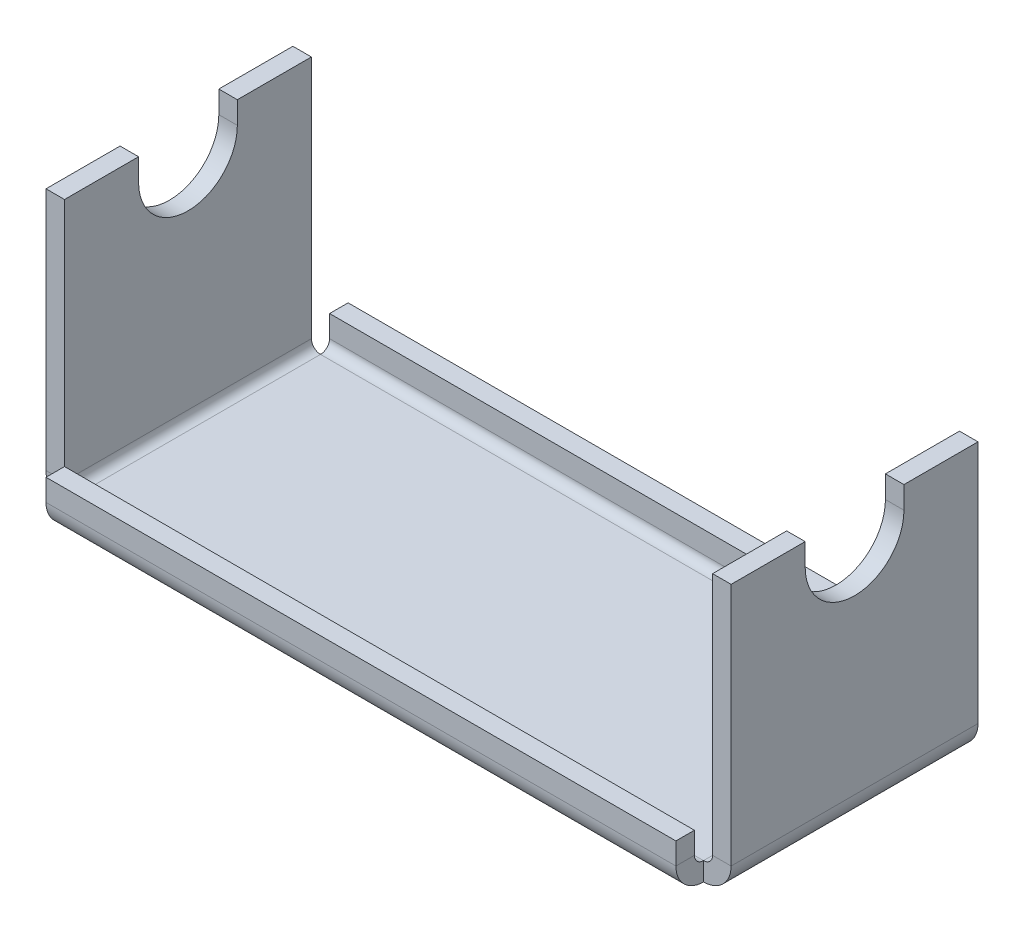
ISO-10303-21;
HEADER;
FILE_DESCRIPTION(('STEP AP214'),'2;1');
FILE_NAME('part.step','',(''),(''),'','','');
FILE_SCHEMA(('AUTOMOTIVE_DESIGN { 1 0 10303 214 1 1 1 1 }'));
ENDSEC;
DATA;
#1=APPLICATION_CONTEXT('core data for automotive mechanical design processes');
#2=APPLICATION_PROTOCOL_DEFINITION('international standard','automotive_design',2000,#1);
#3=PRODUCT_CONTEXT('',#1,'mechanical');
#4=PRODUCT('Part','Part','',(#3));
#5=PRODUCT_RELATED_PRODUCT_CATEGORY('part','',(#4));
#6=PRODUCT_DEFINITION_FORMATION('','',#4);
#7=PRODUCT_DEFINITION_CONTEXT('part definition',#1,'design');
#8=PRODUCT_DEFINITION('design','',#6,#7);
#9=PRODUCT_DEFINITION_SHAPE('','',#8);
#10=(LENGTH_UNIT() NAMED_UNIT(*) SI_UNIT(.MILLI.,.METRE.));
#11=(NAMED_UNIT(*) PLANE_ANGLE_UNIT() SI_UNIT($,.RADIAN.));
#12=(NAMED_UNIT(*) SI_UNIT($,.STERADIAN.) SOLID_ANGLE_UNIT());
#13=UNCERTAINTY_MEASURE_WITH_UNIT(LENGTH_MEASURE(1.E-05),#10,'distance_accuracy_value','');
#14=(GEOMETRIC_REPRESENTATION_CONTEXT(3) GLOBAL_UNCERTAINTY_ASSIGNED_CONTEXT((#13)) GLOBAL_UNIT_ASSIGNED_CONTEXT((#10,
#11,#12)) REPRESENTATION_CONTEXT('',''));
#15=CARTESIAN_POINT('',(0.,0.,0.));
#16=DIRECTION('',(0.,0.,1.));
#17=DIRECTION('',(1.,0.,0.));
#18=AXIS2_PLACEMENT_3D('',#15,#16,#17);
#19=CARTESIAN_POINT('',(-27.7500000000001,20.5,-10.));
#20=DIRECTION('',(0.,-1.,0.));
#21=DIRECTION('',(1.,0.,0.));
#22=AXIS2_PLACEMENT_3D('',#19,#20,#21);
#23=PLANE('',#22);
#24=DIRECTION('',(0.,0.,1.));
#25=VECTOR('',#24,1.);
#26=CARTESIAN_POINT('',(-26.2500000000001,20.5,-10.));
#27=LINE('',#26,#25);
#28=CARTESIAN_POINT('',(-26.2500000000001,20.5,10.));
#29=VERTEX_POINT('',#28);
#30=CARTESIAN_POINT('',(-26.2500000000001,20.5,4.));
#31=VERTEX_POINT('',#30);
#32=EDGE_CURVE('E508',#29,#31,#27,.F.);
#33=ORIENTED_EDGE('',*,*,#32,.T.);
#34=DIRECTION('',(-1.,0.,0.));
#35=VECTOR('',#34,1.);
#36=CARTESIAN_POINT('',(-27.7500000000001,20.5,4.));
#37=LINE('',#36,#35);
#38=CARTESIAN_POINT('',(-27.7500000000001,20.5,4.));
#39=VERTEX_POINT('',#38);
#40=EDGE_CURVE('E343',#31,#39,#37,.T.);
#41=ORIENTED_EDGE('',*,*,#40,.T.);
#42=DIRECTION('',(0.,0.,-1.));
#43=VECTOR('',#42,1.);
#44=CARTESIAN_POINT('',(-27.7500000000001,20.5,0.));
#45=LINE('',#44,#43);
#46=CARTESIAN_POINT('',(-27.7500000000001,20.5,10.));
#47=VERTEX_POINT('',#46);
#48=EDGE_CURVE('E499',#47,#39,#45,.T.);
#49=ORIENTED_EDGE('',*,*,#48,.F.);
#50=DIRECTION('',(1.,0.,0.));
#51=VECTOR('',#50,1.);
#52=CARTESIAN_POINT('',(-27.7500000000001,20.5,10.));
#53=LINE('',#52,#51);
#54=EDGE_CURVE('E489',#47,#29,#53,.T.);
#55=ORIENTED_EDGE('',*,*,#54,.T.);
#56=EDGE_LOOP('',(#33,#41,#49,#55));
#57=FACE_BOUND('',#56,.T.);
#58=ADVANCED_FACE('F120',(#57),#23,.F.);
#59=CARTESIAN_POINT('',(27.7500000000001,20.5,10.));
#60=DIRECTION('',(0.,-1.,0.));
#61=DIRECTION('',(1.,0.,0.));
#62=AXIS2_PLACEMENT_3D('',#59,#60,#61);
#63=PLANE('',#62);
#64=DIRECTION('',(0.,0.,1.));
#65=VECTOR('',#64,1.);
#66=CARTESIAN_POINT('',(27.7500000000001,20.5,0.));
#67=LINE('',#66,#65);
#68=CARTESIAN_POINT('',(27.7500000000001,20.5,4.));
#69=VERTEX_POINT('',#68);
#70=CARTESIAN_POINT('',(27.7500000000001,20.5,10.));
#71=VERTEX_POINT('',#70);
#72=EDGE_CURVE('E443',#69,#71,#67,.T.);
#73=ORIENTED_EDGE('',*,*,#72,.F.);
#74=DIRECTION('',(-1.,0.,0.));
#75=VECTOR('',#74,1.);
#76=CARTESIAN_POINT('',(27.7500000000001,20.5,4.));
#77=LINE('',#76,#75);
#78=CARTESIAN_POINT('',(26.2500000000001,20.5,4.));
#79=VERTEX_POINT('',#78);
#80=EDGE_CURVE('E128',#69,#79,#77,.T.);
#81=ORIENTED_EDGE('',*,*,#80,.T.);
#82=DIRECTION('',(0.,0.,-1.));
#83=VECTOR('',#82,1.);
#84=CARTESIAN_POINT('',(26.2500000000001,20.5,10.));
#85=LINE('',#84,#83);
#86=CARTESIAN_POINT('',(26.2500000000001,20.5,10.));
#87=VERTEX_POINT('',#86);
#88=EDGE_CURVE('E452',#79,#87,#85,.F.);
#89=ORIENTED_EDGE('',*,*,#88,.T.);
#90=DIRECTION('',(-1.,0.,0.));
#91=VECTOR('',#90,1.);
#92=CARTESIAN_POINT('',(27.7500000000001,20.5,10.));
#93=LINE('',#92,#91);
#94=EDGE_CURVE('E439',#71,#87,#93,.T.);
#95=ORIENTED_EDGE('',*,*,#94,.F.);
#96=EDGE_LOOP('',(#73,#81,#89,#95));
#97=FACE_BOUND('',#96,.T.);
#98=ADVANCED_FACE('F561',(#97),#63,.F.);
#99=CARTESIAN_POINT('',(0.,-1.5,0.));
#100=DIRECTION('',(0.,-1.,0.));
#101=DIRECTION('',(0.,0.,-1.));
#102=AXIS2_PLACEMENT_3D('',#99,#100,#101);
#103=PLANE('',#102);
#104=DIRECTION('',(-1.,0.,0.));
#105=VECTOR('',#104,1.);
#106=CARTESIAN_POINT('',(-27.75,-1.5,-10.));
#107=LINE('',#106,#105);
#108=CARTESIAN_POINT('',(25.5134,-1.5,-10.));
#109=VERTEX_POINT('',#108);
#110=CARTESIAN_POINT('',(-25.5134,-1.50000000000001,-10.));
#111=VERTEX_POINT('',#110);
#112=EDGE_CURVE('E545',#109,#111,#107,.T.);
#113=ORIENTED_EDGE('',*,*,#112,.F.);
#114=DIRECTION('',(0.,0.,-1.));
#115=VECTOR('',#114,1.);
#116=CARTESIAN_POINT('',(25.5134,-1.5,-10.));
#117=LINE('',#116,#115);
#118=CARTESIAN_POINT('',(25.5134,-1.5,10.));
#119=VERTEX_POINT('',#118);
#120=EDGE_CURVE('E467',#109,#119,#117,.F.);
#121=ORIENTED_EDGE('',*,*,#120,.T.);
#122=DIRECTION('',(1.,0.,0.));
#123=VECTOR('',#122,1.);
#124=CARTESIAN_POINT('',(-27.75,-1.5,10.));
#125=LINE('',#124,#123);
#126=CARTESIAN_POINT('',(-25.5134,-1.5,10.));
#127=VERTEX_POINT('',#126);
#128=EDGE_CURVE('E548',#127,#119,#125,.T.);
#129=ORIENTED_EDGE('',*,*,#128,.F.);
#130=DIRECTION('',(0.,0.,1.));
#131=VECTOR('',#130,1.);
#132=CARTESIAN_POINT('',(-25.5134,-1.5,10.));
#133=LINE('',#132,#131);
#134=EDGE_CURVE('E523',#127,#111,#133,.F.);
#135=ORIENTED_EDGE('',*,*,#134,.T.);
#136=EDGE_LOOP('',(#113,#121,#129,#135));
#137=FACE_BOUND('',#136,.T.);
#138=ADVANCED_FACE('F599',(#137),#103,.T.);
#139=CARTESIAN_POINT('',(0.,0.,0.));
#140=DIRECTION('',(0.,-1.,0.));
#141=DIRECTION('',(0.,0.,-1.));
#142=AXIS2_PLACEMENT_3D('',#139,#140,#141);
#143=PLANE('',#142);
#144=DIRECTION('',(0.,0.,-1.));
#145=VECTOR('',#144,1.);
#146=CARTESIAN_POINT('',(25.5134,0.,-10.));
#147=LINE('',#146,#145);
#148=CARTESIAN_POINT('',(25.5134,0.,-10.));
#149=VERTEX_POINT('',#148);
#150=CARTESIAN_POINT('',(25.5134,0.,10.));
#151=VERTEX_POINT('',#150);
#152=EDGE_CURVE('E479',#149,#151,#147,.F.);
#153=ORIENTED_EDGE('',*,*,#152,.F.);
#154=DIRECTION('',(-1.,0.,0.));
#155=VECTOR('',#154,1.);
#156=CARTESIAN_POINT('',(-27.75,0.,-10.));
#157=LINE('',#156,#155);
#158=CARTESIAN_POINT('',(-25.5134,0.,-10.));
#159=VERTEX_POINT('',#158);
#160=EDGE_CURVE('E542',#149,#159,#157,.T.);
#161=ORIENTED_EDGE('',*,*,#160,.T.);
#162=DIRECTION('',(0.,0.,1.));
#163=VECTOR('',#162,1.);
#164=CARTESIAN_POINT('',(-25.5134,0.,10.));
#165=LINE('',#164,#163);
#166=CARTESIAN_POINT('',(-25.5134,0.,10.));
#167=VERTEX_POINT('',#166);
#168=EDGE_CURVE('E535',#167,#159,#165,.F.);
#169=ORIENTED_EDGE('',*,*,#168,.F.);
#170=DIRECTION('',(1.,0.,0.));
#171=VECTOR('',#170,1.);
#172=CARTESIAN_POINT('',(-27.75,0.,10.));
#173=LINE('',#172,#171);
#174=EDGE_CURVE('E549',#167,#151,#173,.T.);
#175=ORIENTED_EDGE('',*,*,#174,.T.);
#176=EDGE_LOOP('',(#153,#161,#169,#175));
#177=FACE_BOUND('',#176,.T.);
#178=ADVANCED_FACE('F122',(#177),#143,.F.);
#179=CARTESIAN_POINT('',(-25.5134,0.7366,-10.));
#180=DIRECTION('',(0.,0.,-1.));
#181=DIRECTION('',(-1.,0.,0.));
#182=AXIS2_PLACEMENT_3D('',#179,#180,#181);
#183=PLANE('',#182);
#184=DIRECTION('',(1.,0.,0.));
#185=VECTOR('',#184,1.);
#186=CARTESIAN_POINT('',(-27.75,0.736599999999992,-10.));
#187=LINE('',#186,#185);
#188=CARTESIAN_POINT('',(-26.25,0.736599999999997,-10.));
#189=VERTEX_POINT('',#188);
#190=CARTESIAN_POINT('',(-27.75,0.736599999999992,-10.));
#191=VERTEX_POINT('',#190);
#192=EDGE_CURVE('E486',#189,#191,#187,.F.);
#193=ORIENTED_EDGE('',*,*,#192,.F.);
#194=CARTESIAN_POINT('',(-25.5134,0.7366,-10.));
#195=DIRECTION('',(0.,0.,1.));
#196=DIRECTION('',(1.,0.,0.));
#197=AXIS2_PLACEMENT_3D('',#194,#195,#196);
#198=CIRCLE('',#197,0.7366);
#199=EDGE_CURVE('E532',#159,#189,#198,.F.);
#200=ORIENTED_EDGE('',*,*,#199,.F.);
#201=DIRECTION('',(0.,-1.,0.));
#202=VECTOR('',#201,1.);
#203=CARTESIAN_POINT('',(-25.5134,0.,-10.));
#204=LINE('',#203,#202);
#205=EDGE_CURVE('E539',#159,#111,#204,.T.);
#206=ORIENTED_EDGE('',*,*,#205,.T.);
#207=CARTESIAN_POINT('',(-25.5134,0.7366,-10.));
#208=DIRECTION('',(0.,0.,1.));
#209=DIRECTION('',(1.,0.,0.));
#210=AXIS2_PLACEMENT_3D('',#207,#208,#209);
#211=CIRCLE('',#210,2.2366);
#212=EDGE_CURVE('E525',#111,#191,#211,.F.);
#213=ORIENTED_EDGE('',*,*,#212,.T.);
#214=EDGE_LOOP('',(#193,#200,#206,#213));
#215=FACE_BOUND('',#214,.T.);
#216=ADVANCED_FACE('F639',(#215),#183,.T.);
#217=CARTESIAN_POINT('',(-25.5134,0.7366,10.));
#218=DIRECTION('',(0.,0.,-1.));
#219=DIRECTION('',(-1.,0.,0.));
#220=AXIS2_PLACEMENT_3D('',#217,#218,#219);
#221=PLANE('',#220);
#222=CARTESIAN_POINT('',(-25.5134,0.7366,10.));
#223=DIRECTION('',(0.,0.,1.));
#224=DIRECTION('',(1.,0.,0.));
#225=AXIS2_PLACEMENT_3D('',#222,#223,#224);
#226=CIRCLE('',#225,0.7366);
#227=CARTESIAN_POINT('',(-26.25,0.736599999999997,10.));
#228=VERTEX_POINT('',#227);
#229=EDGE_CURVE('E492',#228,#167,#226,.T.);
#230=ORIENTED_EDGE('',*,*,#229,.F.);
#231=DIRECTION('',(1.,0.,0.));
#232=VECTOR('',#231,1.);
#233=CARTESIAN_POINT('',(-26.25,0.736599999999997,10.));
#234=LINE('',#233,#232);
#235=CARTESIAN_POINT('',(-27.75,0.736599999999992,10.));
#236=VERTEX_POINT('',#235);
#237=EDGE_CURVE('E516',#228,#236,#234,.F.);
#238=ORIENTED_EDGE('',*,*,#237,.T.);
#239=CARTESIAN_POINT('',(-25.5134,0.7366,10.));
#240=DIRECTION('',(0.,0.,1.));
#241=DIRECTION('',(1.,0.,0.));
#242=AXIS2_PLACEMENT_3D('',#239,#240,#241);
#243=CIRCLE('',#242,2.2366);
#244=EDGE_CURVE('E526',#236,#127,#243,.T.);
#245=ORIENTED_EDGE('',*,*,#244,.T.);
#246=DIRECTION('',(0.,-1.,0.));
#247=VECTOR('',#246,1.);
#248=CARTESIAN_POINT('',(-25.5134,0.,10.));
#249=LINE('',#248,#247);
#250=EDGE_CURVE('E529',#167,#127,#249,.T.);
#251=ORIENTED_EDGE('',*,*,#250,.F.);
#252=EDGE_LOOP('',(#230,#238,#245,#251));
#253=FACE_BOUND('',#252,.T.);
#254=ADVANCED_FACE('F656',(#253),#221,.F.);
#255=CARTESIAN_POINT('',(-25.5134,0.7366,10.));
#256=DIRECTION('',(0.,0.,1.));
#257=DIRECTION('',(-1.,0.,0.));
#258=AXIS2_PLACEMENT_3D('',#255,#256,#257);
#259=CYLINDRICAL_SURFACE('',#258,2.2366);
#260=ORIENTED_EDGE('',*,*,#134,.F.);
#261=ORIENTED_EDGE('',*,*,#244,.F.);
#262=DIRECTION('',(0.,0.,1.));
#263=VECTOR('',#262,1.);
#264=CARTESIAN_POINT('',(-27.75,0.736599999999992,-10.));
#265=LINE('',#264,#263);
#266=EDGE_CURVE('E514',#236,#191,#265,.F.);
#267=ORIENTED_EDGE('',*,*,#266,.T.);
#268=ORIENTED_EDGE('',*,*,#212,.F.);
#269=EDGE_LOOP('',(#260,#261,#267,#268));
#270=FACE_BOUND('',#269,.T.);
#271=ADVANCED_FACE('F653',(#270),#259,.T.);
#272=CARTESIAN_POINT('',(-25.5134,0.7366,10.));
#273=DIRECTION('',(0.,0.,1.));
#274=DIRECTION('',(-1.,0.,0.));
#275=AXIS2_PLACEMENT_3D('',#272,#273,#274);
#276=CYLINDRICAL_SURFACE('',#275,0.7366);
#277=ORIENTED_EDGE('',*,*,#168,.T.);
#278=ORIENTED_EDGE('',*,*,#199,.T.);
#279=DIRECTION('',(0.,0.,1.));
#280=VECTOR('',#279,1.);
#281=CARTESIAN_POINT('',(-26.25,0.736599999999997,-10.));
#282=LINE('',#281,#280);
#283=EDGE_CURVE('E519',#189,#228,#282,.T.);
#284=ORIENTED_EDGE('',*,*,#283,.T.);
#285=ORIENTED_EDGE('',*,*,#229,.T.);
#286=EDGE_LOOP('',(#277,#278,#284,#285));
#287=FACE_BOUND('',#286,.T.);
#288=ADVANCED_FACE('F642',(#287),#276,.F.);
#289=CARTESIAN_POINT('',(-27.7500000000001,20.5,10.));
#290=DIRECTION('',(0.,0.,-1.));
#291=DIRECTION('',(-1.,0.,0.));
#292=AXIS2_PLACEMENT_3D('',#289,#290,#291);
#293=PLANE('',#292);
#294=ORIENTED_EDGE('',*,*,#237,.F.);
#295=DIRECTION('',(0.,-1.,0.));
#296=VECTOR('',#295,1.);
#297=CARTESIAN_POINT('',(-26.2500000000001,20.5,10.));
#298=LINE('',#297,#296);
#299=EDGE_CURVE('E512',#228,#29,#298,.F.);
#300=ORIENTED_EDGE('',*,*,#299,.T.);
#301=ORIENTED_EDGE('',*,*,#54,.F.);
#302=DIRECTION('',(0.,1.,0.));
#303=VECTOR('',#302,1.);
#304=CARTESIAN_POINT('',(-27.75,-1.03862598166849E-13,10.));
#305=LINE('',#304,#303);
#306=EDGE_CURVE('E503',#236,#47,#305,.T.);
#307=ORIENTED_EDGE('',*,*,#306,.F.);
#308=EDGE_LOOP('',(#294,#300,#301,#307));
#309=FACE_BOUND('',#308,.T.);
#310=ADVANCED_FACE('F649',(#309),#293,.F.);
#311=CARTESIAN_POINT('',(-27.75,0.,-10.));
#312=DIRECTION('',(0.,0.,1.));
#313=DIRECTION('',(1.,0.,0.));
#314=AXIS2_PLACEMENT_3D('',#311,#312,#313);
#315=PLANE('',#314);
#316=ORIENTED_EDGE('',*,*,#192,.T.);
#317=DIRECTION('',(0.,-1.,0.));
#318=VECTOR('',#317,1.);
#319=CARTESIAN_POINT('',(-27.75,-1.03862598166849E-13,-10.));
#320=LINE('',#319,#318);
#321=CARTESIAN_POINT('',(-27.7500000000001,20.5,-10.));
#322=VERTEX_POINT('',#321);
#323=EDGE_CURVE('E496',#322,#191,#320,.T.);
#324=ORIENTED_EDGE('',*,*,#323,.F.);
#325=DIRECTION('',(1.,0.,0.));
#326=VECTOR('',#325,1.);
#327=CARTESIAN_POINT('',(-27.7500000000001,20.5,-10.));
#328=LINE('',#327,#326);
#329=CARTESIAN_POINT('',(-26.2500000000001,20.5,-10.));
#330=VERTEX_POINT('',#329);
#331=EDGE_CURVE('E493',#322,#330,#328,.T.);
#332=ORIENTED_EDGE('',*,*,#331,.T.);
#333=DIRECTION('',(0.,1.,0.));
#334=VECTOR('',#333,1.);
#335=CARTESIAN_POINT('',(-26.25,0.,-10.));
#336=LINE('',#335,#334);
#337=EDGE_CURVE('E505',#330,#189,#336,.F.);
#338=ORIENTED_EDGE('',*,*,#337,.T.);
#339=EDGE_LOOP('',(#316,#324,#332,#338));
#340=FACE_BOUND('',#339,.T.);
#341=ADVANCED_FACE('F636',(#340),#315,.F.);
#342=CARTESIAN_POINT('',(-27.75,-1.03862598166849E-13,0.));
#343=DIRECTION('',(1.,0.,0.));
#344=DIRECTION('',(0.,1.,0.));
#345=AXIS2_PLACEMENT_3D('',#342,#343,#344);
#346=PLANE('',#345);
#347=ORIENTED_EDGE('',*,*,#48,.T.);
#348=DIRECTION('',(0.,1.,0.));
#349=VECTOR('',#348,1.);
#350=CARTESIAN_POINT('',(-27.7500000000001,22.7000000000003,4.));
#351=LINE('',#350,#349);
#352=CARTESIAN_POINT('',(-27.7500000000001,18.7,4.));
#353=VERTEX_POINT('',#352);
#354=EDGE_CURVE('E332',#353,#39,#351,.T.);
#355=ORIENTED_EDGE('',*,*,#354,.F.);
#356=CARTESIAN_POINT('',(-27.7500000000001,18.7000000000002,0.));
#357=DIRECTION('',(1.,0.,0.));
#358=DIRECTION('',(0.,1.,0.));
#359=AXIS2_PLACEMENT_3D('',#356,#357,#358);
#360=CIRCLE('',#359,4.);
#361=CARTESIAN_POINT('',(-27.7500000000001,18.7,-4.));
#362=VERTEX_POINT('',#361);
#363=EDGE_CURVE('E336',#362,#353,#360,.F.);
#364=ORIENTED_EDGE('',*,*,#363,.F.);
#365=DIRECTION('',(0.,-1.,0.));
#366=VECTOR('',#365,1.);
#367=CARTESIAN_POINT('',(-27.7500000000001,18.7000000000003,-4.));
#368=LINE('',#367,#366);
#369=CARTESIAN_POINT('',(-27.7500000000001,20.5,-4.));
#370=VERTEX_POINT('',#369);
#371=EDGE_CURVE('E334',#370,#362,#368,.T.);
#372=ORIENTED_EDGE('',*,*,#371,.F.);
#373=EDGE_CURVE('E502',#370,#322,#45,.T.);
#374=ORIENTED_EDGE('',*,*,#373,.T.);
#375=ORIENTED_EDGE('',*,*,#323,.T.);
#376=ORIENTED_EDGE('',*,*,#266,.F.);
#377=ORIENTED_EDGE('',*,*,#306,.T.);
#378=EDGE_LOOP('',(#347,#355,#364,#372,#374,#375,#376,#377));
#379=FACE_BOUND('',#378,.T.);
#380=ADVANCED_FACE('F615',(#379),#346,.F.);
#381=CARTESIAN_POINT('',(-26.25,0.,0.));
#382=DIRECTION('',(1.,0.,0.));
#383=DIRECTION('',(0.,1.,0.));
#384=AXIS2_PLACEMENT_3D('',#381,#382,#383);
#385=PLANE('',#384);
#386=DIRECTION('',(0.,-1.,0.));
#387=VECTOR('',#386,1.);
#388=CARTESIAN_POINT('',(-26.25,0.,4.));
#389=LINE('',#388,#387);
#390=CARTESIAN_POINT('',(-26.2500000000001,18.7000000000002,4.));
#391=VERTEX_POINT('',#390);
#392=EDGE_CURVE('E346',#31,#391,#389,.T.);
#393=ORIENTED_EDGE('',*,*,#392,.F.);
#394=ORIENTED_EDGE('',*,*,#32,.F.);
#395=ORIENTED_EDGE('',*,*,#299,.F.);
#396=ORIENTED_EDGE('',*,*,#283,.F.);
#397=ORIENTED_EDGE('',*,*,#337,.F.);
#398=CARTESIAN_POINT('',(-26.2500000000001,20.5,-4.));
#399=VERTEX_POINT('',#398);
#400=EDGE_CURVE('E511',#399,#330,#27,.F.);
#401=ORIENTED_EDGE('',*,*,#400,.F.);
#402=DIRECTION('',(0.,1.,0.));
#403=VECTOR('',#402,1.);
#404=CARTESIAN_POINT('',(-26.25,0.,-4.));
#405=LINE('',#404,#403);
#406=CARTESIAN_POINT('',(-26.2500000000001,18.7000000000002,-4.));
#407=VERTEX_POINT('',#406);
#408=EDGE_CURVE('E135',#407,#399,#405,.T.);
#409=ORIENTED_EDGE('',*,*,#408,.F.);
#410=CARTESIAN_POINT('',(-26.2500000000001,18.7000000000002,0.));
#411=DIRECTION('',(1.,0.,0.));
#412=DIRECTION('',(0.,1.,0.));
#413=AXIS2_PLACEMENT_3D('',#410,#411,#412);
#414=CIRCLE('',#413,4.);
#415=EDGE_CURVE('E348',#391,#407,#414,.T.);
#416=ORIENTED_EDGE('',*,*,#415,.F.);
#417=EDGE_LOOP('',(#393,#394,#395,#396,#397,#401,#409,#416));
#418=FACE_BOUND('',#417,.T.);
#419=ADVANCED_FACE('F606',(#418),#385,.T.);
#420=ORIENTED_EDGE('',*,*,#373,.F.);
#421=DIRECTION('',(1.,0.,0.));
#422=VECTOR('',#421,1.);
#423=CARTESIAN_POINT('',(-27.7500000000001,20.5,-4.));
#424=LINE('',#423,#422);
#425=EDGE_CURVE('E338',#370,#399,#424,.T.);
#426=ORIENTED_EDGE('',*,*,#425,.T.);
#427=ORIENTED_EDGE('',*,*,#400,.T.);
#428=ORIENTED_EDGE('',*,*,#331,.F.);
#429=EDGE_LOOP('',(#420,#426,#427,#428));
#430=FACE_BOUND('',#429,.T.);
#431=ADVANCED_FACE('F595',(#430),#23,.F.);
#432=CARTESIAN_POINT('',(25.5134,0.7366,10.));
#433=DIRECTION('',(0.,0.,1.));
#434=DIRECTION('',(1.,0.,0.));
#435=AXIS2_PLACEMENT_3D('',#432,#433,#434);
#436=PLANE('',#435);
#437=DIRECTION('',(-1.,0.,0.));
#438=VECTOR('',#437,1.);
#439=CARTESIAN_POINT('',(27.75,0.736599999999992,10.));
#440=LINE('',#439,#438);
#441=CARTESIAN_POINT('',(26.25,0.736599999999997,10.));
#442=VERTEX_POINT('',#441);
#443=CARTESIAN_POINT('',(27.75,0.736599999999992,10.));
#444=VERTEX_POINT('',#443);
#445=EDGE_CURVE('E426',#442,#444,#440,.F.);
#446=ORIENTED_EDGE('',*,*,#445,.F.);
#447=CARTESIAN_POINT('',(25.5134,0.7366,10.));
#448=DIRECTION('',(0.,0.,-1.));
#449=DIRECTION('',(-1.,0.,0.));
#450=AXIS2_PLACEMENT_3D('',#447,#448,#449);
#451=CIRCLE('',#450,0.7366);
#452=EDGE_CURVE('E476',#151,#442,#451,.F.);
#453=ORIENTED_EDGE('',*,*,#452,.F.);
#454=DIRECTION('',(0.,-1.,0.));
#455=VECTOR('',#454,1.);
#456=CARTESIAN_POINT('',(25.5134,0.,10.));
#457=LINE('',#456,#455);
#458=EDGE_CURVE('E483',#151,#119,#457,.T.);
#459=ORIENTED_EDGE('',*,*,#458,.T.);
#460=CARTESIAN_POINT('',(25.5134,0.7366,10.));
#461=DIRECTION('',(0.,0.,-1.));
#462=DIRECTION('',(-1.,0.,0.));
#463=AXIS2_PLACEMENT_3D('',#460,#461,#462);
#464=CIRCLE('',#463,2.2366);
#465=EDGE_CURVE('E469',#119,#444,#464,.F.);
#466=ORIENTED_EDGE('',*,*,#465,.T.);
#467=EDGE_LOOP('',(#446,#453,#459,#466));
#468=FACE_BOUND('',#467,.T.);
#469=ADVANCED_FACE('F605',(#468),#436,.T.);
#470=CARTESIAN_POINT('',(25.5134,0.7366,-10.));
#471=DIRECTION('',(0.,0.,1.));
#472=DIRECTION('',(1.,0.,0.));
#473=AXIS2_PLACEMENT_3D('',#470,#471,#472);
#474=PLANE('',#473);
#475=CARTESIAN_POINT('',(25.5134,0.7366,-10.));
#476=DIRECTION('',(0.,0.,-1.));
#477=DIRECTION('',(-1.,0.,0.));
#478=AXIS2_PLACEMENT_3D('',#475,#476,#477);
#479=CIRCLE('',#478,0.7366);
#480=CARTESIAN_POINT('',(26.25,0.736599999999997,-10.));
#481=VERTEX_POINT('',#480);
#482=EDGE_CURVE('E438',#481,#149,#479,.T.);
#483=ORIENTED_EDGE('',*,*,#482,.F.);
#484=DIRECTION('',(-1.,0.,0.));
#485=VECTOR('',#484,1.);
#486=CARTESIAN_POINT('',(26.25,0.736599999999997,-10.));
#487=LINE('',#486,#485);
#488=CARTESIAN_POINT('',(27.75,0.736599999999992,-10.));
#489=VERTEX_POINT('',#488);
#490=EDGE_CURVE('E460',#481,#489,#487,.F.);
#491=ORIENTED_EDGE('',*,*,#490,.T.);
#492=CARTESIAN_POINT('',(25.5134,0.7366,-10.));
#493=DIRECTION('',(0.,0.,-1.));
#494=DIRECTION('',(-1.,0.,0.));
#495=AXIS2_PLACEMENT_3D('',#492,#493,#494);
#496=CIRCLE('',#495,2.2366);
#497=EDGE_CURVE('E470',#489,#109,#496,.T.);
#498=ORIENTED_EDGE('',*,*,#497,.T.);
#499=DIRECTION('',(0.,-1.,0.));
#500=VECTOR('',#499,1.);
#501=CARTESIAN_POINT('',(25.5134,0.,-10.));
#502=LINE('',#501,#500);
#503=EDGE_CURVE('E473',#149,#109,#502,.T.);
#504=ORIENTED_EDGE('',*,*,#503,.F.);
#505=EDGE_LOOP('',(#483,#491,#498,#504));
#506=FACE_BOUND('',#505,.T.);
#507=ADVANCED_FACE('F612',(#506),#474,.F.);
#508=CARTESIAN_POINT('',(25.5134,0.7366,-10.));
#509=DIRECTION('',(0.,0.,-1.));
#510=DIRECTION('',(1.,0.,0.));
#511=AXIS2_PLACEMENT_3D('',#508,#509,#510);
#512=CYLINDRICAL_SURFACE('',#511,2.2366);
#513=ORIENTED_EDGE('',*,*,#120,.F.);
#514=ORIENTED_EDGE('',*,*,#497,.F.);
#515=DIRECTION('',(0.,0.,-1.));
#516=VECTOR('',#515,1.);
#517=CARTESIAN_POINT('',(27.75,0.736599999999992,10.));
#518=LINE('',#517,#516);
#519=EDGE_CURVE('E458',#489,#444,#518,.F.);
#520=ORIENTED_EDGE('',*,*,#519,.T.);
#521=ORIENTED_EDGE('',*,*,#465,.F.);
#522=EDGE_LOOP('',(#513,#514,#520,#521));
#523=FACE_BOUND('',#522,.T.);
#524=ADVANCED_FACE('F727',(#523),#512,.T.);
#525=CARTESIAN_POINT('',(25.5134,0.7366,-10.));
#526=DIRECTION('',(0.,0.,-1.));
#527=DIRECTION('',(1.,0.,0.));
#528=AXIS2_PLACEMENT_3D('',#525,#526,#527);
#529=CYLINDRICAL_SURFACE('',#528,0.7366);
#530=ORIENTED_EDGE('',*,*,#152,.T.);
#531=ORIENTED_EDGE('',*,*,#452,.T.);
#532=DIRECTION('',(0.,0.,-1.));
#533=VECTOR('',#532,1.);
#534=CARTESIAN_POINT('',(26.25,0.736599999999997,10.));
#535=LINE('',#534,#533);
#536=EDGE_CURVE('E463',#442,#481,#535,.T.);
#537=ORIENTED_EDGE('',*,*,#536,.T.);
#538=ORIENTED_EDGE('',*,*,#482,.T.);
#539=EDGE_LOOP('',(#530,#531,#537,#538));
#540=FACE_BOUND('',#539,.T.);
#541=ADVANCED_FACE('F726',(#540),#529,.F.);
#542=CARTESIAN_POINT('',(27.75,0.,10.));
#543=DIRECTION('',(0.,0.,-1.));
#544=DIRECTION('',(-1.,0.,0.));
#545=AXIS2_PLACEMENT_3D('',#542,#543,#544);
#546=PLANE('',#545);
#547=ORIENTED_EDGE('',*,*,#445,.T.);
#548=DIRECTION('',(0.,-1.,0.));
#549=VECTOR('',#548,1.);
#550=CARTESIAN_POINT('',(27.75,-1.03862598166848E-13,10.));
#551=LINE('',#550,#549);
#552=EDGE_CURVE('E446',#71,#444,#551,.T.);
#553=ORIENTED_EDGE('',*,*,#552,.F.);
#554=ORIENTED_EDGE('',*,*,#94,.T.);
#555=DIRECTION('',(0.,1.,0.));
#556=VECTOR('',#555,1.);
#557=CARTESIAN_POINT('',(26.25,0.,10.));
#558=LINE('',#557,#556);
#559=EDGE_CURVE('E455',#87,#442,#558,.F.);
#560=ORIENTED_EDGE('',*,*,#559,.T.);
#561=EDGE_LOOP('',(#547,#553,#554,#560));
#562=FACE_BOUND('',#561,.T.);
#563=ADVANCED_FACE('F571',(#562),#546,.F.);
#564=CARTESIAN_POINT('',(27.7500000000001,20.5,-10.));
#565=DIRECTION('',(0.,0.,1.));
#566=DIRECTION('',(1.,0.,0.));
#567=AXIS2_PLACEMENT_3D('',#564,#565,#566);
#568=PLANE('',#567);
#569=ORIENTED_EDGE('',*,*,#490,.F.);
#570=DIRECTION('',(0.,-1.,0.));
#571=VECTOR('',#570,1.);
#572=CARTESIAN_POINT('',(26.2500000000001,20.5,-10.));
#573=LINE('',#572,#571);
#574=CARTESIAN_POINT('',(26.2500000000001,20.5,-10.));
#575=VERTEX_POINT('',#574);
#576=EDGE_CURVE('E453',#481,#575,#573,.F.);
#577=ORIENTED_EDGE('',*,*,#576,.T.);
#578=DIRECTION('',(-1.,0.,0.));
#579=VECTOR('',#578,1.);
#580=CARTESIAN_POINT('',(27.7500000000001,20.5,-10.));
#581=LINE('',#580,#579);
#582=CARTESIAN_POINT('',(27.7500000000001,20.5,-10.));
#583=VERTEX_POINT('',#582);
#584=EDGE_CURVE('E435',#583,#575,#581,.T.);
#585=ORIENTED_EDGE('',*,*,#584,.F.);
#586=DIRECTION('',(0.,1.,0.));
#587=VECTOR('',#586,1.);
#588=CARTESIAN_POINT('',(27.75,-1.03862598166848E-13,-10.));
#589=LINE('',#588,#587);
#590=EDGE_CURVE('E444',#489,#583,#589,.T.);
#591=ORIENTED_EDGE('',*,*,#590,.F.);
#592=EDGE_LOOP('',(#569,#577,#585,#591));
#593=FACE_BOUND('',#592,.T.);
#594=ADVANCED_FACE('F716',(#593),#568,.F.);
#595=CARTESIAN_POINT('',(27.75,-1.03862598166848E-13,0.));
#596=DIRECTION('',(-1.,0.,0.));
#597=DIRECTION('',(0.,-1.,0.));
#598=AXIS2_PLACEMENT_3D('',#595,#596,#597);
#599=PLANE('',#598);
#600=CARTESIAN_POINT('',(27.75,18.7,0.));
#601=DIRECTION('',(1.,0.,0.));
#602=DIRECTION('',(0.,1.,0.));
#603=AXIS2_PLACEMENT_3D('',#600,#601,#602);
#604=CIRCLE('',#603,4.);
#605=CARTESIAN_POINT('',(27.75,18.7,4.));
#606=VERTEX_POINT('',#605);
#607=CARTESIAN_POINT('',(27.75,18.7,-4.));
#608=VERTEX_POINT('',#607);
#609=EDGE_CURVE('E314',#606,#608,#604,.T.);
#610=ORIENTED_EDGE('',*,*,#609,.F.);
#611=DIRECTION('',(0.,-1.,0.));
#612=VECTOR('',#611,1.);
#613=CARTESIAN_POINT('',(27.7500000000001,22.7,4.));
#614=LINE('',#613,#612);
#615=EDGE_CURVE('E311',#69,#606,#614,.T.);
#616=ORIENTED_EDGE('',*,*,#615,.F.);
#617=ORIENTED_EDGE('',*,*,#72,.T.);
#618=ORIENTED_EDGE('',*,*,#552,.T.);
#619=ORIENTED_EDGE('',*,*,#519,.F.);
#620=ORIENTED_EDGE('',*,*,#590,.T.);
#621=CARTESIAN_POINT('',(27.7500000000001,20.5,-4.));
#622=VERTEX_POINT('',#621);
#623=EDGE_CURVE('E325',#583,#622,#67,.T.);
#624=ORIENTED_EDGE('',*,*,#623,.T.);
#625=DIRECTION('',(0.,1.,0.));
#626=VECTOR('',#625,1.);
#627=CARTESIAN_POINT('',(27.75,18.7,-4.));
#628=LINE('',#627,#626);
#629=EDGE_CURVE('E143',#608,#622,#628,.T.);
#630=ORIENTED_EDGE('',*,*,#629,.F.);
#631=EDGE_LOOP('',(#610,#616,#617,#618,#619,#620,#624,#630));
#632=FACE_BOUND('',#631,.T.);
#633=ADVANCED_FACE('F323',(#632),#599,.F.);
#634=CARTESIAN_POINT('',(26.25,0.,0.));
#635=DIRECTION('',(-1.,0.,0.));
#636=DIRECTION('',(0.,-1.,0.));
#637=AXIS2_PLACEMENT_3D('',#634,#635,#636);
#638=PLANE('',#637);
#639=DIRECTION('',(0.,1.,0.));
#640=VECTOR('',#639,1.);
#641=CARTESIAN_POINT('',(26.25,0.,4.));
#642=LINE('',#641,#640);
#643=CARTESIAN_POINT('',(26.25,18.7,4.));
#644=VERTEX_POINT('',#643);
#645=EDGE_CURVE('E341',#644,#79,#642,.T.);
#646=ORIENTED_EDGE('',*,*,#645,.F.);
#647=CARTESIAN_POINT('',(26.25,18.7,0.));
#648=DIRECTION('',(-1.,0.,0.));
#649=DIRECTION('',(0.,-1.,0.));
#650=AXIS2_PLACEMENT_3D('',#647,#648,#649);
#651=CIRCLE('',#650,4.);
#652=CARTESIAN_POINT('',(26.25,18.7,-4.));
#653=VERTEX_POINT('',#652);
#654=EDGE_CURVE('E13',#653,#644,#651,.T.);
#655=ORIENTED_EDGE('',*,*,#654,.F.);
#656=DIRECTION('',(0.,-1.,0.));
#657=VECTOR('',#656,1.);
#658=CARTESIAN_POINT('',(26.25,0.,-4.));
#659=LINE('',#658,#657);
#660=CARTESIAN_POINT('',(26.2500000000001,20.5,-4.));
#661=VERTEX_POINT('',#660);
#662=EDGE_CURVE('E307',#661,#653,#659,.T.);
#663=ORIENTED_EDGE('',*,*,#662,.F.);
#664=EDGE_CURVE('E449',#575,#661,#85,.F.);
#665=ORIENTED_EDGE('',*,*,#664,.F.);
#666=ORIENTED_EDGE('',*,*,#576,.F.);
#667=ORIENTED_EDGE('',*,*,#536,.F.);
#668=ORIENTED_EDGE('',*,*,#559,.F.);
#669=ORIENTED_EDGE('',*,*,#88,.F.);
#670=EDGE_LOOP('',(#646,#655,#663,#665,#666,#667,#668,#669));
#671=FACE_BOUND('',#670,.T.);
#672=ADVANCED_FACE('F567',(#671),#638,.T.);
#673=ORIENTED_EDGE('',*,*,#664,.T.);
#674=DIRECTION('',(1.,0.,0.));
#675=VECTOR('',#674,1.);
#676=CARTESIAN_POINT('',(27.7500000000001,20.5,-4.));
#677=LINE('',#676,#675);
#678=EDGE_CURVE('E552',#661,#622,#677,.T.);
#679=ORIENTED_EDGE('',*,*,#678,.T.);
#680=ORIENTED_EDGE('',*,*,#623,.F.);
#681=ORIENTED_EDGE('',*,*,#584,.T.);
#682=EDGE_LOOP('',(#673,#679,#680,#681));
#683=FACE_BOUND('',#682,.T.);
#684=ADVANCED_FACE('F601',(#683),#63,.F.);
#685=CARTESIAN_POINT('',(-25.5134,0.736599999999997,10.));
#686=DIRECTION('',(-1.,0.,0.));
#687=DIRECTION('',(0.,0.,1.));
#688=AXIS2_PLACEMENT_3D('',#685,#686,#687);
#689=PLANE('',#688);
#690=DIRECTION('',(0.,0.,-1.));
#691=VECTOR('',#690,1.);
#692=CARTESIAN_POINT('',(-25.5134,0.736599999999997,12.2366));
#693=LINE('',#692,#691);
#694=CARTESIAN_POINT('',(-25.5134,0.736599999999997,10.7366));
#695=VERTEX_POINT('',#694);
#696=CARTESIAN_POINT('',(-25.5134,0.736599999999997,12.2366));
#697=VERTEX_POINT('',#696);
#698=EDGE_CURVE('E384',#695,#697,#693,.F.);
#699=ORIENTED_EDGE('',*,*,#698,.F.);
#700=CARTESIAN_POINT('',(-25.5134,0.736599999999997,10.));
#701=DIRECTION('',(1.,0.,0.));
#702=DIRECTION('',(0.,0.,-1.));
#703=AXIS2_PLACEMENT_3D('',#700,#701,#702);
#704=CIRCLE('',#703,0.736599999999997);
#705=EDGE_CURVE('E430',#167,#695,#704,.F.);
#706=ORIENTED_EDGE('',*,*,#705,.F.);
#707=ORIENTED_EDGE('',*,*,#250,.T.);
#708=CARTESIAN_POINT('',(-25.5134,0.736599999999997,10.));
#709=DIRECTION('',(1.,0.,0.));
#710=DIRECTION('',(0.,0.,-1.));
#711=AXIS2_PLACEMENT_3D('',#708,#709,#710);
#712=CIRCLE('',#711,2.2366);
#713=EDGE_CURVE('E423',#127,#697,#712,.F.);
#714=ORIENTED_EDGE('',*,*,#713,.T.);
#715=EDGE_LOOP('',(#699,#706,#707,#714));
#716=FACE_BOUND('',#715,.T.);
#717=ADVANCED_FACE('F669',(#716),#689,.T.);
#718=CARTESIAN_POINT('',(25.5134,0.736599999999997,10.));
#719=DIRECTION('',(-1.,0.,0.));
#720=DIRECTION('',(0.,0.,1.));
#721=AXIS2_PLACEMENT_3D('',#718,#719,#720);
#722=PLANE('',#721);
#723=CARTESIAN_POINT('',(25.5134,0.736599999999997,10.));
#724=DIRECTION('',(1.,0.,0.));
#725=DIRECTION('',(0.,0.,-1.));
#726=AXIS2_PLACEMENT_3D('',#723,#724,#725);
#727=CIRCLE('',#726,0.736599999999997);
#728=CARTESIAN_POINT('',(25.5134,0.736599999999997,10.7366));
#729=VERTEX_POINT('',#728);
#730=EDGE_CURVE('E396',#729,#151,#727,.T.);
#731=ORIENTED_EDGE('',*,*,#730,.F.);
#732=DIRECTION('',(0.,0.,-1.));
#733=VECTOR('',#732,1.);
#734=CARTESIAN_POINT('',(25.5134,0.736599999999997,10.7366));
#735=LINE('',#734,#733);
#736=CARTESIAN_POINT('',(25.5134,0.736599999999997,12.2366));
#737=VERTEX_POINT('',#736);
#738=EDGE_CURVE('E416',#729,#737,#735,.F.);
#739=ORIENTED_EDGE('',*,*,#738,.T.);
#740=CARTESIAN_POINT('',(25.5134,0.736599999999997,10.));
#741=DIRECTION('',(1.,0.,0.));
#742=DIRECTION('',(0.,0.,-1.));
#743=AXIS2_PLACEMENT_3D('',#740,#741,#742);
#744=CIRCLE('',#743,2.2366);
#745=EDGE_CURVE('E427',#737,#119,#744,.T.);
#746=ORIENTED_EDGE('',*,*,#745,.T.);
#747=ORIENTED_EDGE('',*,*,#458,.F.);
#748=EDGE_LOOP('',(#731,#739,#746,#747));
#749=FACE_BOUND('',#748,.T.);
#750=ADVANCED_FACE('F690',(#749),#722,.F.);
#751=CARTESIAN_POINT('',(25.5134,0.736599999999997,10.));
#752=DIRECTION('',(1.,0.,0.));
#753=DIRECTION('',(0.,0.,1.));
#754=AXIS2_PLACEMENT_3D('',#751,#752,#753);
#755=CYLINDRICAL_SURFACE('',#754,2.2366);
#756=ORIENTED_EDGE('',*,*,#128,.T.);
#757=ORIENTED_EDGE('',*,*,#745,.F.);
#758=DIRECTION('',(1.,0.,0.));
#759=VECTOR('',#758,1.);
#760=CARTESIAN_POINT('',(-25.5134,0.736599999999997,12.2366));
#761=LINE('',#760,#759);
#762=EDGE_CURVE('E414',#737,#697,#761,.F.);
#763=ORIENTED_EDGE('',*,*,#762,.T.);
#764=ORIENTED_EDGE('',*,*,#713,.F.);
#765=EDGE_LOOP('',(#756,#757,#763,#764));
#766=FACE_BOUND('',#765,.T.);
#767=ADVANCED_FACE('F704',(#766),#755,.T.);
#768=CARTESIAN_POINT('',(25.5134,0.736599999999997,10.));
#769=DIRECTION('',(1.,0.,0.));
#770=DIRECTION('',(0.,0.,1.));
#771=AXIS2_PLACEMENT_3D('',#768,#769,#770);
#772=CYLINDRICAL_SURFACE('',#771,0.736599999999997);
#773=ORIENTED_EDGE('',*,*,#174,.F.);
#774=ORIENTED_EDGE('',*,*,#705,.T.);
#775=DIRECTION('',(1.,0.,0.));
#776=VECTOR('',#775,1.);
#777=CARTESIAN_POINT('',(-25.5134,0.736599999999997,10.7366));
#778=LINE('',#777,#776);
#779=EDGE_CURVE('E419',#695,#729,#778,.T.);
#780=ORIENTED_EDGE('',*,*,#779,.T.);
#781=ORIENTED_EDGE('',*,*,#730,.T.);
#782=EDGE_LOOP('',(#773,#774,#780,#781));
#783=FACE_BOUND('',#782,.T.);
#784=ADVANCED_FACE('F665',(#783),#772,.F.);
#785=CARTESIAN_POINT('',(-25.5134,0.,12.2366));
#786=DIRECTION('',(1.,0.,0.));
#787=DIRECTION('',(0.,0.,-1.));
#788=AXIS2_PLACEMENT_3D('',#785,#786,#787);
#789=PLANE('',#788);
#790=ORIENTED_EDGE('',*,*,#698,.T.);
#791=DIRECTION('',(0.,-1.,0.));
#792=VECTOR('',#791,1.);
#793=CARTESIAN_POINT('',(-25.5134,0.,12.2366));
#794=LINE('',#793,#792);
#795=CARTESIAN_POINT('',(-25.5134,2.5,12.2366));
#796=VERTEX_POINT('',#795);
#797=EDGE_CURVE('E404',#796,#697,#794,.T.);
#798=ORIENTED_EDGE('',*,*,#797,.F.);
#799=DIRECTION('',(0.,0.,-1.));
#800=VECTOR('',#799,1.);
#801=CARTESIAN_POINT('',(-25.5134,2.5,12.2366));
#802=LINE('',#801,#800);
#803=CARTESIAN_POINT('',(-25.5134,2.5,10.7366));
#804=VERTEX_POINT('',#803);
#805=EDGE_CURVE('E397',#796,#804,#802,.T.);
#806=ORIENTED_EDGE('',*,*,#805,.T.);
#807=DIRECTION('',(0.,1.,0.));
#808=VECTOR('',#807,1.);
#809=CARTESIAN_POINT('',(-25.5134,0.,10.7366));
#810=LINE('',#809,#808);
#811=EDGE_CURVE('E411',#804,#695,#810,.F.);
#812=ORIENTED_EDGE('',*,*,#811,.T.);
#813=EDGE_LOOP('',(#790,#798,#806,#812));
#814=FACE_BOUND('',#813,.T.);
#815=ADVANCED_FACE('F673',(#814),#789,.F.);
#816=CARTESIAN_POINT('',(25.5134,2.5,12.2366));
#817=DIRECTION('',(-1.,0.,0.));
#818=DIRECTION('',(0.,0.,1.));
#819=AXIS2_PLACEMENT_3D('',#816,#817,#818);
#820=PLANE('',#819);
#821=ORIENTED_EDGE('',*,*,#738,.F.);
#822=DIRECTION('',(0.,-1.,0.));
#823=VECTOR('',#822,1.);
#824=CARTESIAN_POINT('',(25.5134,2.5,10.7366));
#825=LINE('',#824,#823);
#826=CARTESIAN_POINT('',(25.5134,2.5,10.7366));
#827=VERTEX_POINT('',#826);
#828=EDGE_CURVE('E409',#729,#827,#825,.F.);
#829=ORIENTED_EDGE('',*,*,#828,.T.);
#830=DIRECTION('',(0.,0.,-1.));
#831=VECTOR('',#830,1.);
#832=CARTESIAN_POINT('',(25.5134,2.5,12.2366));
#833=LINE('',#832,#831);
#834=CARTESIAN_POINT('',(25.5134,2.5,12.2366));
#835=VERTEX_POINT('',#834);
#836=EDGE_CURVE('E393',#835,#827,#833,.T.);
#837=ORIENTED_EDGE('',*,*,#836,.F.);
#838=DIRECTION('',(0.,1.,0.));
#839=VECTOR('',#838,1.);
#840=CARTESIAN_POINT('',(25.5134,0.,12.2366));
#841=LINE('',#840,#839);
#842=EDGE_CURVE('E402',#737,#835,#841,.T.);
#843=ORIENTED_EDGE('',*,*,#842,.F.);
#844=EDGE_LOOP('',(#821,#829,#837,#843));
#845=FACE_BOUND('',#844,.T.);
#846=ADVANCED_FACE('F692',(#845),#820,.F.);
#847=CARTESIAN_POINT('',(0.,0.,12.2366));
#848=DIRECTION('',(0.,0.,-1.));
#849=DIRECTION('',(-1.,0.,0.));
#850=AXIS2_PLACEMENT_3D('',#847,#848,#849);
#851=PLANE('',#850);
#852=ORIENTED_EDGE('',*,*,#762,.F.);
#853=ORIENTED_EDGE('',*,*,#842,.T.);
#854=DIRECTION('',(-1.,0.,0.));
#855=VECTOR('',#854,1.);
#856=CARTESIAN_POINT('',(0.,2.5,12.2366));
#857=LINE('',#856,#855);
#858=EDGE_CURVE('E400',#835,#796,#857,.T.);
#859=ORIENTED_EDGE('',*,*,#858,.T.);
#860=ORIENTED_EDGE('',*,*,#797,.T.);
#861=EDGE_LOOP('',(#852,#853,#859,#860));
#862=FACE_BOUND('',#861,.T.);
#863=ADVANCED_FACE('F677',(#862),#851,.F.);
#864=CARTESIAN_POINT('',(0.,0.,10.7366));
#865=DIRECTION('',(0.,0.,-1.));
#866=DIRECTION('',(-1.,0.,0.));
#867=AXIS2_PLACEMENT_3D('',#864,#865,#866);
#868=PLANE('',#867);
#869=ORIENTED_EDGE('',*,*,#828,.F.);
#870=ORIENTED_EDGE('',*,*,#779,.F.);
#871=ORIENTED_EDGE('',*,*,#811,.F.);
#872=DIRECTION('',(1.,0.,0.));
#873=VECTOR('',#872,1.);
#874=CARTESIAN_POINT('',(-25.5134,2.5,10.7366));
#875=LINE('',#874,#873);
#876=EDGE_CURVE('E407',#827,#804,#875,.F.);
#877=ORIENTED_EDGE('',*,*,#876,.F.);
#878=EDGE_LOOP('',(#869,#870,#871,#877));
#879=FACE_BOUND('',#878,.T.);
#880=ADVANCED_FACE('F687',(#879),#868,.T.);
#881=CARTESIAN_POINT('',(-25.5134,2.5,12.2366));
#882=DIRECTION('',(0.,-1.,0.));
#883=DIRECTION('',(0.,0.,-1.));
#884=AXIS2_PLACEMENT_3D('',#881,#882,#883);
#885=PLANE('',#884);
#886=ORIENTED_EDGE('',*,*,#876,.T.);
#887=ORIENTED_EDGE('',*,*,#805,.F.);
#888=ORIENTED_EDGE('',*,*,#858,.F.);
#889=ORIENTED_EDGE('',*,*,#836,.T.);
#890=EDGE_LOOP('',(#886,#887,#888,#889));
#891=FACE_BOUND('',#890,.T.);
#892=ADVANCED_FACE('F683',(#891),#885,.F.);
#893=CARTESIAN_POINT('',(25.5134,0.736599999999992,-10.));
#894=DIRECTION('',(1.,0.,0.));
#895=DIRECTION('',(0.,0.,-1.));
#896=AXIS2_PLACEMENT_3D('',#893,#894,#895);
#897=PLANE('',#896);
#898=DIRECTION('',(0.,0.,1.));
#899=VECTOR('',#898,1.);
#900=CARTESIAN_POINT('',(25.5134,0.736600000000007,-12.2366));
#901=LINE('',#900,#899);
#902=CARTESIAN_POINT('',(25.5134,0.736599999999989,-10.7366));
#903=VERTEX_POINT('',#902);
#904=CARTESIAN_POINT('',(25.5134,0.736599999999984,-12.2366));
#905=VERTEX_POINT('',#904);
#906=EDGE_CURVE('E350',#903,#905,#901,.F.);
#907=ORIENTED_EDGE('',*,*,#906,.F.);
#908=CARTESIAN_POINT('',(25.5134,0.736599999999992,-10.));
#909=DIRECTION('',(-1.,0.,0.));
#910=DIRECTION('',(0.,0.,1.));
#911=AXIS2_PLACEMENT_3D('',#908,#909,#910);
#912=CIRCLE('',#911,0.7366);
#913=EDGE_CURVE('E388',#149,#903,#912,.F.);
#914=ORIENTED_EDGE('',*,*,#913,.F.);
#915=ORIENTED_EDGE('',*,*,#503,.T.);
#916=CARTESIAN_POINT('',(25.5134,0.736599999999992,-10.));
#917=DIRECTION('',(-1.,0.,0.));
#918=DIRECTION('',(0.,0.,1.));
#919=AXIS2_PLACEMENT_3D('',#916,#917,#918);
#920=CIRCLE('',#919,2.2366);
#921=EDGE_CURVE('E381',#109,#905,#920,.F.);
#922=ORIENTED_EDGE('',*,*,#921,.T.);
#923=EDGE_LOOP('',(#907,#914,#915,#922));
#924=FACE_BOUND('',#923,.T.);
#925=ADVANCED_FACE('F762',(#924),#897,.T.);
#926=CARTESIAN_POINT('',(-25.5134,0.736599999999992,-10.));
#927=DIRECTION('',(1.,0.,0.));
#928=DIRECTION('',(0.,0.,-1.));
#929=AXIS2_PLACEMENT_3D('',#926,#927,#928);
#930=PLANE('',#929);
#931=CARTESIAN_POINT('',(-25.5134,0.736599999999992,-10.));
#932=DIRECTION('',(-1.,0.,0.));
#933=DIRECTION('',(0.,0.,1.));
#934=AXIS2_PLACEMENT_3D('',#931,#932,#933);
#935=CIRCLE('',#934,0.7366);
#936=CARTESIAN_POINT('',(-25.5134,0.736599999999989,-10.7366));
#937=VERTEX_POINT('',#936);
#938=EDGE_CURVE('E354',#937,#159,#935,.T.);
#939=ORIENTED_EDGE('',*,*,#938,.F.);
#940=DIRECTION('',(0.,0.,1.));
#941=VECTOR('',#940,1.);
#942=CARTESIAN_POINT('',(-25.5134,0.736599999999997,-10.7366));
#943=LINE('',#942,#941);
#944=CARTESIAN_POINT('',(-25.5134,0.736600000000007,-12.2366));
#945=VERTEX_POINT('',#944);
#946=EDGE_CURVE('E374',#937,#945,#943,.F.);
#947=ORIENTED_EDGE('',*,*,#946,.T.);
#948=CARTESIAN_POINT('',(-25.5134,0.736599999999992,-10.));
#949=DIRECTION('',(-1.,0.,0.));
#950=DIRECTION('',(0.,0.,1.));
#951=AXIS2_PLACEMENT_3D('',#948,#949,#950);
#952=CIRCLE('',#951,2.2366);
#953=EDGE_CURVE('E385',#945,#111,#952,.T.);
#954=ORIENTED_EDGE('',*,*,#953,.T.);
#955=ORIENTED_EDGE('',*,*,#205,.F.);
#956=EDGE_LOOP('',(#939,#947,#954,#955));
#957=FACE_BOUND('',#956,.T.);
#958=ADVANCED_FACE('F800',(#957),#930,.F.);
#959=CARTESIAN_POINT('',(-25.5134,0.736599999999992,-10.));
#960=DIRECTION('',(-1.,0.,0.));
#961=DIRECTION('',(0.,0.,-1.));
#962=AXIS2_PLACEMENT_3D('',#959,#960,#961);
#963=CYLINDRICAL_SURFACE('',#962,2.2366);
#964=ORIENTED_EDGE('',*,*,#112,.T.);
#965=ORIENTED_EDGE('',*,*,#953,.F.);
#966=DIRECTION('',(-1.,0.,0.));
#967=VECTOR('',#966,1.);
#968=CARTESIAN_POINT('',(25.5134,0.736600000000007,-12.2366));
#969=LINE('',#968,#967);
#970=EDGE_CURVE('E372',#945,#905,#969,.F.);
#971=ORIENTED_EDGE('',*,*,#970,.T.);
#972=ORIENTED_EDGE('',*,*,#921,.F.);
#973=EDGE_LOOP('',(#964,#965,#971,#972));
#974=FACE_BOUND('',#973,.T.);
#975=ADVANCED_FACE('F764',(#974),#963,.T.);
#976=CARTESIAN_POINT('',(-25.5134,0.736599999999992,-10.));
#977=DIRECTION('',(-1.,0.,0.));
#978=DIRECTION('',(0.,0.,-1.));
#979=AXIS2_PLACEMENT_3D('',#976,#977,#978);
#980=CYLINDRICAL_SURFACE('',#979,0.7366);
#981=ORIENTED_EDGE('',*,*,#160,.F.);
#982=ORIENTED_EDGE('',*,*,#913,.T.);
#983=DIRECTION('',(-1.,0.,0.));
#984=VECTOR('',#983,1.);
#985=CARTESIAN_POINT('',(25.5134,0.736599999999997,-10.7366));
#986=LINE('',#985,#984);
#987=EDGE_CURVE('E377',#903,#937,#986,.T.);
#988=ORIENTED_EDGE('',*,*,#987,.T.);
#989=ORIENTED_EDGE('',*,*,#938,.T.);
#990=EDGE_LOOP('',(#981,#982,#988,#989));
#991=FACE_BOUND('',#990,.T.);
#992=ADVANCED_FACE('F783',(#991),#980,.F.);
#993=CARTESIAN_POINT('',(25.5134,0.,-12.2366));
#994=DIRECTION('',(-1.,0.,0.));
#995=DIRECTION('',(0.,0.,1.));
#996=AXIS2_PLACEMENT_3D('',#993,#994,#995);
#997=PLANE('',#996);
#998=ORIENTED_EDGE('',*,*,#906,.T.);
#999=DIRECTION('',(0.,-1.,0.));
#1000=VECTOR('',#999,1.);
#1001=CARTESIAN_POINT('',(25.5134,0.,-12.2366));
#1002=LINE('',#1001,#1000);
#1003=CARTESIAN_POINT('',(25.5134,2.5,-12.2366));
#1004=VERTEX_POINT('',#1003);
#1005=EDGE_CURVE('E362',#1004,#905,#1002,.T.);
#1006=ORIENTED_EDGE('',*,*,#1005,.F.);
#1007=DIRECTION('',(0.,0.,1.));
#1008=VECTOR('',#1007,1.);
#1009=CARTESIAN_POINT('',(25.5134,2.5,-12.2366));
#1010=LINE('',#1009,#1008);
#1011=CARTESIAN_POINT('',(25.5134,2.5,-10.7366));
#1012=VERTEX_POINT('',#1011);
#1013=EDGE_CURVE('E355',#1004,#1012,#1010,.T.);
#1014=ORIENTED_EDGE('',*,*,#1013,.T.);
#1015=DIRECTION('',(0.,1.,0.));
#1016=VECTOR('',#1015,1.);
#1017=CARTESIAN_POINT('',(25.5134,0.,-10.7366));
#1018=LINE('',#1017,#1016);
#1019=EDGE_CURVE('E369',#1012,#903,#1018,.F.);
#1020=ORIENTED_EDGE('',*,*,#1019,.T.);
#1021=EDGE_LOOP('',(#998,#1006,#1014,#1020));
#1022=FACE_BOUND('',#1021,.T.);
#1023=ADVANCED_FACE('F780',(#1022),#997,.F.);
#1024=CARTESIAN_POINT('',(-25.5134,2.5,-12.2366));
#1025=DIRECTION('',(1.,0.,0.));
#1026=DIRECTION('',(0.,0.,-1.));
#1027=AXIS2_PLACEMENT_3D('',#1024,#1025,#1026);
#1028=PLANE('',#1027);
#1029=ORIENTED_EDGE('',*,*,#946,.F.);
#1030=DIRECTION('',(0.,-1.,0.));
#1031=VECTOR('',#1030,1.);
#1032=CARTESIAN_POINT('',(-25.5134,2.5,-10.7366));
#1033=LINE('',#1032,#1031);
#1034=CARTESIAN_POINT('',(-25.5134,2.5,-10.7366));
#1035=VERTEX_POINT('',#1034);
#1036=EDGE_CURVE('E367',#937,#1035,#1033,.F.);
#1037=ORIENTED_EDGE('',*,*,#1036,.T.);
#1038=DIRECTION('',(0.,0.,1.));
#1039=VECTOR('',#1038,1.);
#1040=CARTESIAN_POINT('',(-25.5134,2.5,-12.2366));
#1041=LINE('',#1040,#1039);
#1042=CARTESIAN_POINT('',(-25.5134,2.5,-12.2366));
#1043=VERTEX_POINT('',#1042);
#1044=EDGE_CURVE('E351',#1043,#1035,#1041,.T.);
#1045=ORIENTED_EDGE('',*,*,#1044,.F.);
#1046=DIRECTION('',(0.,1.,0.));
#1047=VECTOR('',#1046,1.);
#1048=CARTESIAN_POINT('',(-25.5134,0.,-12.2366));
#1049=LINE('',#1048,#1047);
#1050=EDGE_CURVE('E360',#945,#1043,#1049,.T.);
#1051=ORIENTED_EDGE('',*,*,#1050,.F.);
#1052=EDGE_LOOP('',(#1029,#1037,#1045,#1051));
#1053=FACE_BOUND('',#1052,.T.);
#1054=ADVANCED_FACE('F773',(#1053),#1028,.F.);
#1055=CARTESIAN_POINT('',(0.,0.,-12.2366));
#1056=DIRECTION('',(0.,0.,1.));
#1057=DIRECTION('',(0.,-1.,0.));
#1058=AXIS2_PLACEMENT_3D('',#1055,#1056,#1057);
#1059=PLANE('',#1058);
#1060=ORIENTED_EDGE('',*,*,#970,.F.);
#1061=ORIENTED_EDGE('',*,*,#1050,.T.);
#1062=DIRECTION('',(1.,0.,0.));
#1063=VECTOR('',#1062,1.);
#1064=CARTESIAN_POINT('',(0.,2.5,-12.2366));
#1065=LINE('',#1064,#1063);
#1066=EDGE_CURVE('E358',#1043,#1004,#1065,.T.);
#1067=ORIENTED_EDGE('',*,*,#1066,.T.);
#1068=ORIENTED_EDGE('',*,*,#1005,.T.);
#1069=EDGE_LOOP('',(#1060,#1061,#1067,#1068));
#1070=FACE_BOUND('',#1069,.T.);
#1071=ADVANCED_FACE('F768',(#1070),#1059,.F.);
#1072=CARTESIAN_POINT('',(0.,0.,-10.7366));
#1073=DIRECTION('',(0.,0.,1.));
#1074=DIRECTION('',(0.,-1.,0.));
#1075=AXIS2_PLACEMENT_3D('',#1072,#1073,#1074);
#1076=PLANE('',#1075);
#1077=ORIENTED_EDGE('',*,*,#1036,.F.);
#1078=ORIENTED_EDGE('',*,*,#987,.F.);
#1079=ORIENTED_EDGE('',*,*,#1019,.F.);
#1080=DIRECTION('',(-1.,0.,0.));
#1081=VECTOR('',#1080,1.);
#1082=CARTESIAN_POINT('',(25.5134,2.5,-10.7366));
#1083=LINE('',#1082,#1081);
#1084=EDGE_CURVE('E365',#1035,#1012,#1083,.F.);
#1085=ORIENTED_EDGE('',*,*,#1084,.F.);
#1086=EDGE_LOOP('',(#1077,#1078,#1079,#1085));
#1087=FACE_BOUND('',#1086,.T.);
#1088=ADVANCED_FACE('F586',(#1087),#1076,.T.);
#1089=CARTESIAN_POINT('',(25.5134,2.5,-12.2366));
#1090=DIRECTION('',(0.,-1.,0.));
#1091=DIRECTION('',(0.,0.,-1.));
#1092=AXIS2_PLACEMENT_3D('',#1089,#1090,#1091);
#1093=PLANE('',#1092);
#1094=ORIENTED_EDGE('',*,*,#1084,.T.);
#1095=ORIENTED_EDGE('',*,*,#1013,.F.);
#1096=ORIENTED_EDGE('',*,*,#1066,.F.);
#1097=ORIENTED_EDGE('',*,*,#1044,.T.);
#1098=EDGE_LOOP('',(#1094,#1095,#1096,#1097));
#1099=FACE_BOUND('',#1098,.T.);
#1100=ADVANCED_FACE('F577',(#1099),#1093,.F.);
#1101=CARTESIAN_POINT('',(-39.0637084989848,22.7000000000002,4.));
#1102=DIRECTION('',(0.,0.,1.));
#1103=DIRECTION('',(0.,-1.,0.));
#1104=AXIS2_PLACEMENT_3D('',#1101,#1102,#1103);
#1105=PLANE('',#1104);
#1106=ORIENTED_EDGE('',*,*,#645,.T.);
#1107=ORIENTED_EDGE('',*,*,#80,.F.);
#1108=ORIENTED_EDGE('',*,*,#615,.T.);
#1109=DIRECTION('',(1.,0.,0.));
#1110=VECTOR('',#1109,1.);
#1111=CARTESIAN_POINT('',(-39.0637084989849,18.7000000000002,4.));
#1112=LINE('',#1111,#1110);
#1113=EDGE_CURVE('E317',#644,#606,#1112,.T.);
#1114=ORIENTED_EDGE('',*,*,#1113,.F.);
#1115=EDGE_LOOP('',(#1106,#1107,#1108,#1114));
#1116=FACE_BOUND('',#1115,.T.);
#1117=ADVANCED_FACE('F575',(#1116),#1105,.F.);
#1118=CARTESIAN_POINT('',(-39.0637084989849,18.7000000000002,-4.));
#1119=DIRECTION('',(0.,0.,-1.));
#1120=DIRECTION('',(-1.,0.,0.));
#1121=AXIS2_PLACEMENT_3D('',#1118,#1119,#1120);
#1122=PLANE('',#1121);
#1123=ORIENTED_EDGE('',*,*,#662,.T.);
#1124=DIRECTION('',(1.,0.,0.));
#1125=VECTOR('',#1124,1.);
#1126=CARTESIAN_POINT('',(-39.0637084989849,18.7000000000002,-4.));
#1127=LINE('',#1126,#1125);
#1128=EDGE_CURVE('E303',#653,#608,#1127,.T.);
#1129=ORIENTED_EDGE('',*,*,#1128,.T.);
#1130=ORIENTED_EDGE('',*,*,#629,.T.);
#1131=ORIENTED_EDGE('',*,*,#678,.F.);
#1132=EDGE_LOOP('',(#1123,#1129,#1130,#1131));
#1133=FACE_BOUND('',#1132,.T.);
#1134=ADVANCED_FACE('F305',(#1133),#1122,.F.);
#1135=CARTESIAN_POINT('',(-39.0637084989849,18.7000000000002,0.));
#1136=DIRECTION('',(1.,0.,0.));
#1137=DIRECTION('',(0.,1.,0.));
#1138=AXIS2_PLACEMENT_3D('',#1135,#1136,#1137);
#1139=CYLINDRICAL_SURFACE('',#1138,4.);
#1140=ORIENTED_EDGE('',*,*,#654,.T.);
#1141=ORIENTED_EDGE('',*,*,#1113,.T.);
#1142=ORIENTED_EDGE('',*,*,#609,.T.);
#1143=ORIENTED_EDGE('',*,*,#1128,.F.);
#1144=EDGE_LOOP('',(#1140,#1141,#1142,#1143));
#1145=FACE_BOUND('',#1144,.T.);
#1146=ADVANCED_FACE('F315',(#1145),#1139,.F.);
#1147=ORIENTED_EDGE('',*,*,#415,.T.);
#1148=EDGE_CURVE('E310',#362,#407,#1127,.T.);
#1149=ORIENTED_EDGE('',*,*,#1148,.F.);
#1150=ORIENTED_EDGE('',*,*,#363,.T.);
#1151=EDGE_CURVE('E330',#353,#391,#1112,.T.);
#1152=ORIENTED_EDGE('',*,*,#1151,.T.);
#1153=EDGE_LOOP('',(#1147,#1149,#1150,#1152));
#1154=FACE_BOUND('',#1153,.T.);
#1155=ADVANCED_FACE('F590',(#1154),#1139,.F.);
#1156=ORIENTED_EDGE('',*,*,#392,.T.);
#1157=ORIENTED_EDGE('',*,*,#1151,.F.);
#1158=ORIENTED_EDGE('',*,*,#354,.T.);
#1159=ORIENTED_EDGE('',*,*,#40,.F.);
#1160=EDGE_LOOP('',(#1156,#1157,#1158,#1159));
#1161=FACE_BOUND('',#1160,.T.);
#1162=ADVANCED_FACE('F579',(#1161),#1105,.F.);
#1163=ORIENTED_EDGE('',*,*,#408,.T.);
#1164=ORIENTED_EDGE('',*,*,#425,.F.);
#1165=ORIENTED_EDGE('',*,*,#371,.T.);
#1166=ORIENTED_EDGE('',*,*,#1148,.T.);
#1167=EDGE_LOOP('',(#1163,#1164,#1165,#1166));
#1168=FACE_BOUND('',#1167,.T.);
#1169=ADVANCED_FACE('F585',(#1168),#1122,.F.);
#1170=CLOSED_SHELL('',(#58,#98,#138,#178,#216,#254,#271,#288,#310,#341,#380,#419,#431,#469,#507,
#524,#541,#563,#594,#633,#672,#684,#717,#750,#767,#784,#815,#846,#863,#880,#892,#925,#958,#975,
#992,#1023,#1054,#1071,#1088,#1100,#1117,#1134,#1146,#1155,#1162,#1169));
#1171=MANIFOLD_SOLID_BREP('B2',#1170);
#1172=ADVANCED_BREP_SHAPE_REPRESENTATION('',(#18,#1171),#14);
#1173=SHAPE_DEFINITION_REPRESENTATION(#9,#1172);
ENDSEC;
END-ISO-10303-21;
